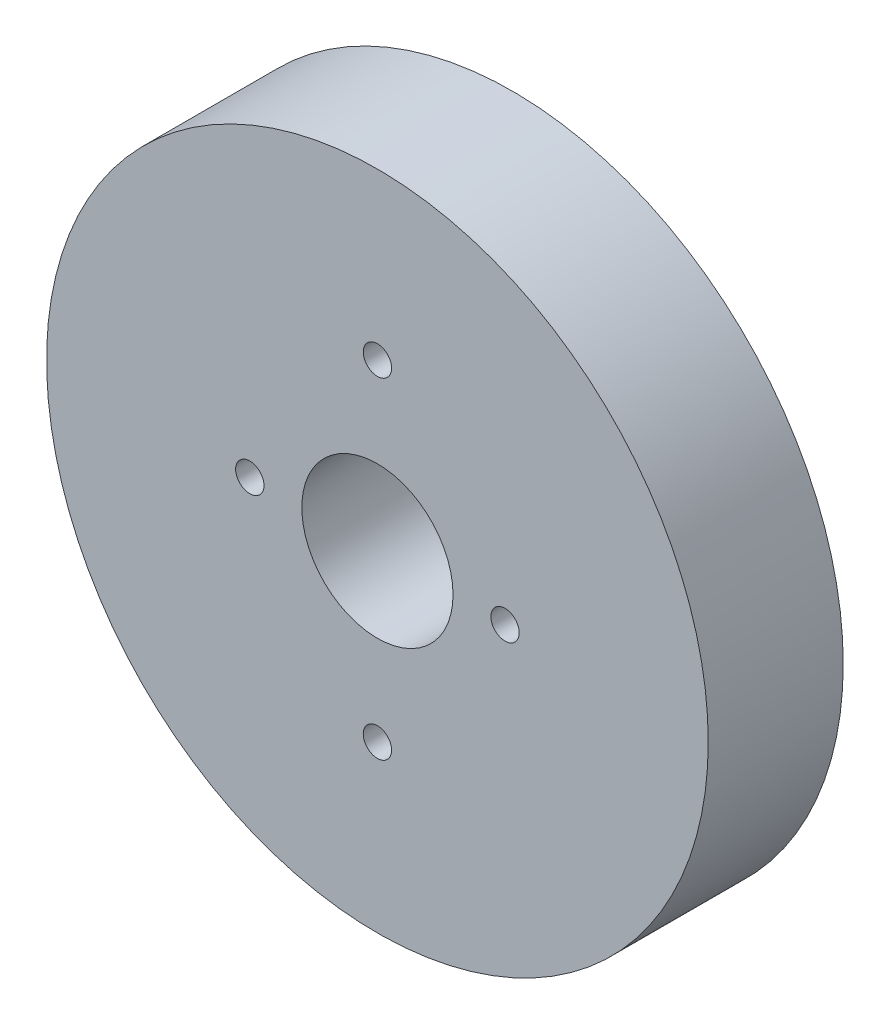
ISO-10303-21;
HEADER;
FILE_DESCRIPTION(('STEP AP214'),'2;1');
FILE_NAME('part.step','',(''),(''),'','','');
FILE_SCHEMA(('AUTOMOTIVE_DESIGN { 1 0 10303 214 1 1 1 1 }'));
ENDSEC;
DATA;
#1=APPLICATION_CONTEXT('core data for automotive mechanical design processes');
#2=APPLICATION_PROTOCOL_DEFINITION('international standard','automotive_design',2000,#1);
#3=PRODUCT_CONTEXT('',#1,'mechanical');
#4=PRODUCT('Part','Part','',(#3));
#5=PRODUCT_RELATED_PRODUCT_CATEGORY('part','',(#4));
#6=PRODUCT_DEFINITION_FORMATION('','',#4);
#7=PRODUCT_DEFINITION_CONTEXT('part definition',#1,'design');
#8=PRODUCT_DEFINITION('design','',#6,#7);
#9=PRODUCT_DEFINITION_SHAPE('','',#8);
#10=(LENGTH_UNIT() NAMED_UNIT(*) SI_UNIT(.MILLI.,.METRE.));
#11=(NAMED_UNIT(*) PLANE_ANGLE_UNIT() SI_UNIT($,.RADIAN.));
#12=(NAMED_UNIT(*) SI_UNIT($,.STERADIAN.) SOLID_ANGLE_UNIT());
#13=UNCERTAINTY_MEASURE_WITH_UNIT(LENGTH_MEASURE(1.E-05),#10,'distance_accuracy_value','');
#14=(GEOMETRIC_REPRESENTATION_CONTEXT(3) GLOBAL_UNCERTAINTY_ASSIGNED_CONTEXT((#13)) GLOBAL_UNIT_ASSIGNED_CONTEXT((#10,
#11,#12)) REPRESENTATION_CONTEXT('',''));
#15=CARTESIAN_POINT('',(0.,0.,0.));
#16=DIRECTION('',(0.,0.,1.));
#17=DIRECTION('',(1.,0.,0.));
#18=AXIS2_PLACEMENT_3D('',#15,#16,#17);
#19=CARTESIAN_POINT('',(0.,0.,7.14));
#20=DIRECTION('',(0.,0.,1.));
#21=DIRECTION('',(1.,0.,0.));
#22=AXIS2_PLACEMENT_3D('',#19,#20,#21);
#23=PLANE('',#22);
#24=CARTESIAN_POINT('',(-6.75,0.,7.14));
#25=DIRECTION('',(0.,0.,1.));
#26=DIRECTION('',(-1.,0.,0.));
#27=AXIS2_PLACEMENT_3D('',#24,#25,#26);
#28=CIRCLE('',#27,0.749999999999999);
#29=CARTESIAN_POINT('',(-7.5,0.,7.14));
#30=VERTEX_POINT('',#29);
#31=EDGE_CURVE('E59',#30,#30,#28,.T.);
#32=ORIENTED_EDGE('',*,*,#31,.F.);
#33=EDGE_LOOP('',(#32));
#34=FACE_BOUND('',#33,.T.);
#35=CARTESIAN_POINT('',(6.75,0.,7.14));
#36=DIRECTION('',(0.,0.,1.));
#37=DIRECTION('',(1.,0.,0.));
#38=AXIS2_PLACEMENT_3D('',#35,#36,#37);
#39=CIRCLE('',#38,0.749999999999999);
#40=CARTESIAN_POINT('',(7.5,0.,7.14));
#41=VERTEX_POINT('',#40);
#42=EDGE_CURVE('E47',#41,#41,#39,.T.);
#43=ORIENTED_EDGE('',*,*,#42,.F.);
#44=EDGE_LOOP('',(#43));
#45=FACE_BOUND('',#44,.T.);
#46=CARTESIAN_POINT('',(0.,0.,7.14));
#47=DIRECTION('',(0.,0.,1.));
#48=DIRECTION('',(1.,0.,0.));
#49=AXIS2_PLACEMENT_3D('',#46,#47,#48);
#50=CIRCLE('',#49,17.5);
#51=CARTESIAN_POINT('',(17.5,0.,7.14));
#52=VERTEX_POINT('',#51);
#53=EDGE_CURVE('E10',#52,#52,#50,.T.);
#54=ORIENTED_EDGE('',*,*,#53,.T.);
#55=EDGE_LOOP('',(#54));
#56=FACE_BOUND('',#55,.T.);
#57=CARTESIAN_POINT('',(0.,0.,7.14));
#58=DIRECTION('',(0.,0.,1.));
#59=DIRECTION('',(1.,0.,0.));
#60=AXIS2_PLACEMENT_3D('',#57,#58,#59);
#61=CIRCLE('',#60,4.);
#62=CARTESIAN_POINT('',(4.,0.,7.14));
#63=VERTEX_POINT('',#62);
#64=EDGE_CURVE('E42',#63,#63,#61,.T.);
#65=ORIENTED_EDGE('',*,*,#64,.F.);
#66=EDGE_LOOP('',(#65));
#67=FACE_BOUND('',#66,.T.);
#68=CARTESIAN_POINT('',(0.,8.75,7.14));
#69=DIRECTION('',(0.,0.,1.));
#70=DIRECTION('',(1.,0.,0.));
#71=AXIS2_PLACEMENT_3D('',#68,#69,#70);
#72=CIRCLE('',#71,0.75);
#73=CARTESIAN_POINT('',(0.75,8.75,7.14));
#74=VERTEX_POINT('',#73);
#75=EDGE_CURVE('E53',#74,#74,#72,.T.);
#76=ORIENTED_EDGE('',*,*,#75,.F.);
#77=EDGE_LOOP('',(#76));
#78=FACE_BOUND('',#77,.T.);
#79=CARTESIAN_POINT('',(0.,-8.75,7.14));
#80=DIRECTION('',(0.,0.,1.));
#81=DIRECTION('',(-1.,0.,0.));
#82=AXIS2_PLACEMENT_3D('',#79,#80,#81);
#83=CIRCLE('',#82,0.75);
#84=CARTESIAN_POINT('',(-0.75,-8.75,7.14));
#85=VERTEX_POINT('',#84);
#86=EDGE_CURVE('E65',#85,#85,#83,.T.);
#87=ORIENTED_EDGE('',*,*,#86,.F.);
#88=EDGE_LOOP('',(#87));
#89=FACE_BOUND('',#88,.T.);
#90=ADVANCED_FACE('F31',(#34,#45,#56,#67,#78,#89),#23,.T.);
#91=CARTESIAN_POINT('',(0.,0.,0.));
#92=DIRECTION('',(0.,0.,1.));
#93=DIRECTION('',(1.,0.,0.));
#94=AXIS2_PLACEMENT_3D('',#91,#92,#93);
#95=PLANE('',#94);
#96=CARTESIAN_POINT('',(0.,0.,0.));
#97=DIRECTION('',(0.,0.,1.));
#98=DIRECTION('',(1.,0.,0.));
#99=AXIS2_PLACEMENT_3D('',#96,#97,#98);
#100=CIRCLE('',#99,17.5);
#101=CARTESIAN_POINT('',(17.5,0.,0.));
#102=VERTEX_POINT('',#101);
#103=EDGE_CURVE('E35',#102,#102,#100,.T.);
#104=ORIENTED_EDGE('',*,*,#103,.F.);
#105=EDGE_LOOP('',(#104));
#106=FACE_BOUND('',#105,.T.);
#107=CARTESIAN_POINT('',(0.,0.,0.));
#108=DIRECTION('',(0.,0.,1.));
#109=DIRECTION('',(1.,0.,0.));
#110=AXIS2_PLACEMENT_3D('',#107,#108,#109);
#111=CIRCLE('',#110,4.);
#112=CARTESIAN_POINT('',(4.,0.,0.));
#113=VERTEX_POINT('',#112);
#114=EDGE_CURVE('E44',#113,#113,#111,.T.);
#115=ORIENTED_EDGE('',*,*,#114,.T.);
#116=EDGE_LOOP('',(#115));
#117=FACE_BOUND('',#116,.T.);
#118=CARTESIAN_POINT('',(6.75,0.,0.));
#119=DIRECTION('',(0.,0.,1.));
#120=DIRECTION('',(1.,0.,0.));
#121=AXIS2_PLACEMENT_3D('',#118,#119,#120);
#122=CIRCLE('',#121,0.749999999999999);
#123=CARTESIAN_POINT('',(7.5,0.,0.));
#124=VERTEX_POINT('',#123);
#125=EDGE_CURVE('E50',#124,#124,#122,.T.);
#126=ORIENTED_EDGE('',*,*,#125,.T.);
#127=EDGE_LOOP('',(#126));
#128=FACE_BOUND('',#127,.T.);
#129=CARTESIAN_POINT('',(0.,8.75,0.));
#130=DIRECTION('',(0.,0.,1.));
#131=DIRECTION('',(1.,0.,0.));
#132=AXIS2_PLACEMENT_3D('',#129,#130,#131);
#133=CIRCLE('',#132,0.75);
#134=CARTESIAN_POINT('',(0.75,8.75,0.));
#135=VERTEX_POINT('',#134);
#136=EDGE_CURVE('E56',#135,#135,#133,.T.);
#137=ORIENTED_EDGE('',*,*,#136,.T.);
#138=EDGE_LOOP('',(#137));
#139=FACE_BOUND('',#138,.T.);
#140=CARTESIAN_POINT('',(-6.75,0.,0.));
#141=DIRECTION('',(0.,0.,1.));
#142=DIRECTION('',(-1.,0.,0.));
#143=AXIS2_PLACEMENT_3D('',#140,#141,#142);
#144=CIRCLE('',#143,0.749999999999999);
#145=CARTESIAN_POINT('',(-7.5,0.,0.));
#146=VERTEX_POINT('',#145);
#147=EDGE_CURVE('E62',#146,#146,#144,.T.);
#148=ORIENTED_EDGE('',*,*,#147,.T.);
#149=EDGE_LOOP('',(#148));
#150=FACE_BOUND('',#149,.T.);
#151=CARTESIAN_POINT('',(0.,-8.75,0.));
#152=DIRECTION('',(0.,0.,1.));
#153=DIRECTION('',(-1.,0.,0.));
#154=AXIS2_PLACEMENT_3D('',#151,#152,#153);
#155=CIRCLE('',#154,0.75);
#156=CARTESIAN_POINT('',(-0.75,-8.75,0.));
#157=VERTEX_POINT('',#156);
#158=EDGE_CURVE('E68',#157,#157,#155,.T.);
#159=ORIENTED_EDGE('',*,*,#158,.T.);
#160=EDGE_LOOP('',(#159));
#161=FACE_BOUND('',#160,.T.);
#162=ADVANCED_FACE('F78',(#106,#117,#128,#139,#150,#161),#95,.F.);
#163=CARTESIAN_POINT('',(0.,0.,7.14));
#164=DIRECTION('',(0.,0.,-1.));
#165=DIRECTION('',(-1.,0.,0.));
#166=AXIS2_PLACEMENT_3D('',#163,#164,#165);
#167=CYLINDRICAL_SURFACE('',#166,17.5);
#168=ORIENTED_EDGE('',*,*,#53,.F.);
#169=EDGE_LOOP('',(#168));
#170=FACE_BOUND('',#169,.T.);
#171=ORIENTED_EDGE('',*,*,#103,.T.);
#172=EDGE_LOOP('',(#171));
#173=FACE_BOUND('',#172,.T.);
#174=ADVANCED_FACE('F33',(#170,#173),#167,.T.);
#175=CARTESIAN_POINT('',(0.,0.,7.14));
#176=DIRECTION('',(0.,0.,-1.));
#177=DIRECTION('',(-1.,0.,0.));
#178=AXIS2_PLACEMENT_3D('',#175,#176,#177);
#179=CYLINDRICAL_SURFACE('',#178,4.);
#180=ORIENTED_EDGE('',*,*,#64,.T.);
#181=EDGE_LOOP('',(#180));
#182=FACE_BOUND('',#181,.T.);
#183=ORIENTED_EDGE('',*,*,#114,.F.);
#184=EDGE_LOOP('',(#183));
#185=FACE_BOUND('',#184,.T.);
#186=ADVANCED_FACE('F88',(#182,#185),#179,.F.);
#187=CARTESIAN_POINT('',(6.75,0.,7.14));
#188=DIRECTION('',(0.,0.,-1.));
#189=DIRECTION('',(-1.,0.,0.));
#190=AXIS2_PLACEMENT_3D('',#187,#188,#189);
#191=CYLINDRICAL_SURFACE('',#190,0.749999999999999);
#192=ORIENTED_EDGE('',*,*,#42,.T.);
#193=EDGE_LOOP('',(#192));
#194=FACE_BOUND('',#193,.T.);
#195=ORIENTED_EDGE('',*,*,#125,.F.);
#196=EDGE_LOOP('',(#195));
#197=FACE_BOUND('',#196,.T.);
#198=ADVANCED_FACE('F91',(#194,#197),#191,.F.);
#199=CARTESIAN_POINT('',(0.,8.75,7.14));
#200=DIRECTION('',(0.,0.,-1.));
#201=DIRECTION('',(-1.,0.,0.));
#202=AXIS2_PLACEMENT_3D('',#199,#200,#201);
#203=CYLINDRICAL_SURFACE('',#202,0.75);
#204=ORIENTED_EDGE('',*,*,#75,.T.);
#205=EDGE_LOOP('',(#204));
#206=FACE_BOUND('',#205,.T.);
#207=ORIENTED_EDGE('',*,*,#136,.F.);
#208=EDGE_LOOP('',(#207));
#209=FACE_BOUND('',#208,.T.);
#210=ADVANCED_FACE('F95',(#206,#209),#203,.F.);
#211=CARTESIAN_POINT('',(-6.75,0.,7.14));
#212=DIRECTION('',(0.,0.,-1.));
#213=DIRECTION('',(-1.,0.,0.));
#214=AXIS2_PLACEMENT_3D('',#211,#212,#213);
#215=CYLINDRICAL_SURFACE('',#214,0.749999999999999);
#216=ORIENTED_EDGE('',*,*,#31,.T.);
#217=EDGE_LOOP('',(#216));
#218=FACE_BOUND('',#217,.T.);
#219=ORIENTED_EDGE('',*,*,#147,.F.);
#220=EDGE_LOOP('',(#219));
#221=FACE_BOUND('',#220,.T.);
#222=ADVANCED_FACE('F99',(#218,#221),#215,.F.);
#223=CARTESIAN_POINT('',(0.,-8.75,7.14));
#224=DIRECTION('',(0.,0.,-1.));
#225=DIRECTION('',(-1.,0.,0.));
#226=AXIS2_PLACEMENT_3D('',#223,#224,#225);
#227=CYLINDRICAL_SURFACE('',#226,0.75);
#228=ORIENTED_EDGE('',*,*,#86,.T.);
#229=EDGE_LOOP('',(#228));
#230=FACE_BOUND('',#229,.T.);
#231=ORIENTED_EDGE('',*,*,#158,.F.);
#232=EDGE_LOOP('',(#231));
#233=FACE_BOUND('',#232,.T.);
#234=ADVANCED_FACE('F74',(#230,#233),#227,.F.);
#235=CLOSED_SHELL('',(#90,#162,#174,#186,#198,#210,#222,#234));
#236=MANIFOLD_SOLID_BREP('B2',#235);
#237=ADVANCED_BREP_SHAPE_REPRESENTATION('',(#18,#236),#14);
#238=SHAPE_DEFINITION_REPRESENTATION(#9,#237);
ENDSEC;
END-ISO-10303-21;
